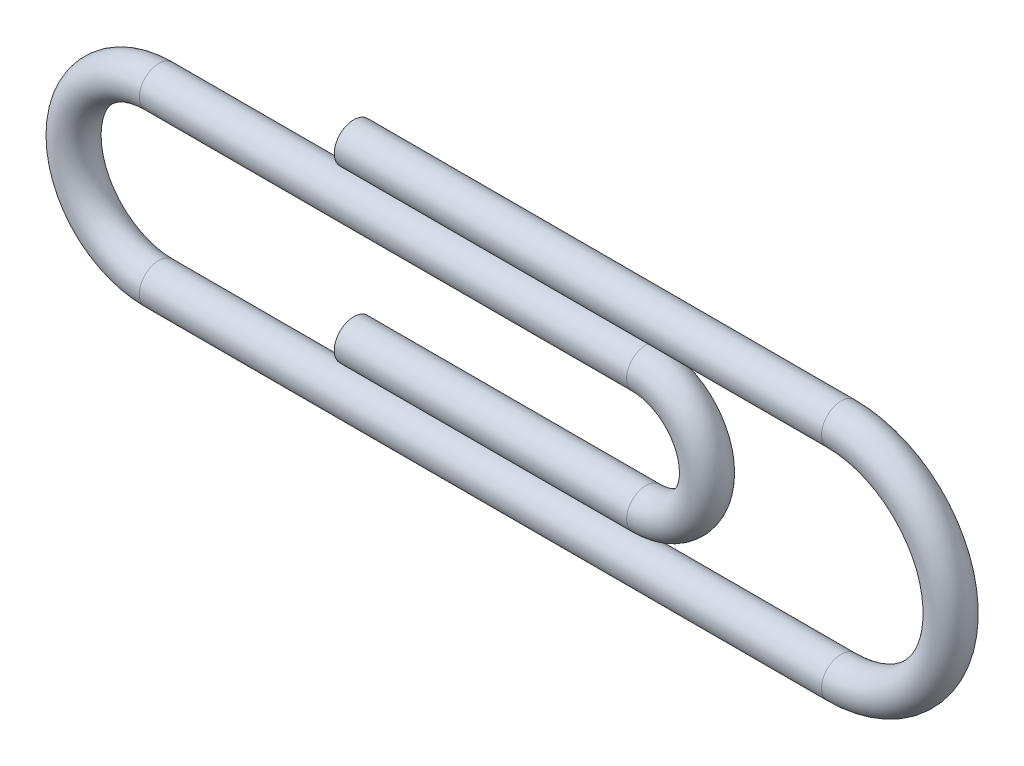
ISO-10303-21;
HEADER;
FILE_DESCRIPTION(('STEP AP214'),'2;1');
FILE_NAME('part.step','',(''),(''),'','','');
FILE_SCHEMA(('AUTOMOTIVE_DESIGN { 1 0 10303 214 1 1 1 1 }'));
ENDSEC;
DATA;
#1=APPLICATION_CONTEXT('core data for automotive mechanical design processes');
#2=APPLICATION_PROTOCOL_DEFINITION('international standard','automotive_design',2000,#1);
#3=PRODUCT_CONTEXT('',#1,'mechanical');
#4=PRODUCT('Part','Part','',(#3));
#5=PRODUCT_RELATED_PRODUCT_CATEGORY('part','',(#4));
#6=PRODUCT_DEFINITION_FORMATION('','',#4);
#7=PRODUCT_DEFINITION_CONTEXT('part definition',#1,'design');
#8=PRODUCT_DEFINITION('design','',#6,#7);
#9=PRODUCT_DEFINITION_SHAPE('','',#8);
#10=(LENGTH_UNIT() NAMED_UNIT(*) SI_UNIT(.MILLI.,.METRE.));
#11=(NAMED_UNIT(*) PLANE_ANGLE_UNIT() SI_UNIT($,.RADIAN.));
#12=(NAMED_UNIT(*) SI_UNIT($,.STERADIAN.) SOLID_ANGLE_UNIT());
#13=UNCERTAINTY_MEASURE_WITH_UNIT(LENGTH_MEASURE(1.E-05),#10,'distance_accuracy_value','');
#14=(GEOMETRIC_REPRESENTATION_CONTEXT(3) GLOBAL_UNCERTAINTY_ASSIGNED_CONTEXT((#13)) GLOBAL_UNIT_ASSIGNED_CONTEXT((#10,
#11,#12)) REPRESENTATION_CONTEXT('',''));
#15=CARTESIAN_POINT('',(0.,0.,0.));
#16=DIRECTION('',(0.,0.,1.));
#17=DIRECTION('',(1.,0.,0.));
#18=AXIS2_PLACEMENT_3D('',#15,#16,#17);
#19=CARTESIAN_POINT('',(60.0000000000001,-12.5,0.));
#20=DIRECTION('',(-1.,0.,0.));
#21=DIRECTION('',(0.,0.,1.));
#22=AXIS2_PLACEMENT_3D('',#19,#20,#21);
#23=CYLINDRICAL_SURFACE('',#22,4.);
#24=CARTESIAN_POINT('',(60.0000000000001,-12.5,0.));
#25=DIRECTION('',(1.,0.,0.));
#26=DIRECTION('',(0.,1.,0.));
#27=AXIS2_PLACEMENT_3D('',#24,#25,#26);
#28=CIRCLE('',#27,4.);
#29=CARTESIAN_POINT('',(60.0000000000002,-16.5,0.));
#30=VERTEX_POINT('',#29);
#31=EDGE_CURVE('E411',#30,#30,#28,.T.);
#32=ORIENTED_EDGE('',*,*,#31,.F.);
#33=EDGE_LOOP('',(#32));
#34=FACE_BOUND('',#33,.T.);
#35=CARTESIAN_POINT('',(0.,-12.5,0.));
#36=DIRECTION('',(1.,0.,0.));
#37=DIRECTION('',(0.,1.,0.));
#38=AXIS2_PLACEMENT_3D('',#35,#36,#37);
#39=CIRCLE('',#38,4.);
#40=CARTESIAN_POINT('',(0.,-8.5,0.));
#41=VERTEX_POINT('',#40);
#42=EDGE_CURVE('E13',#41,#41,#39,.T.);
#43=ORIENTED_EDGE('',*,*,#42,.T.);
#44=EDGE_LOOP('',(#43));
#45=FACE_BOUND('',#44,.T.);
#46=ADVANCED_FACE('F44',(#34,#45),#23,.T.);
#47=CARTESIAN_POINT('',(60.0000000000001,-15.3867513459481,0.));
#48=DIRECTION('',(0.,0.866025403784439,0.5));
#49=DIRECTION('',(0.,-0.5,0.866025403784439));
#50=AXIS2_PLACEMENT_3D('',#47,#48,#49);
#51=PLANE('',#50);
#52=DIRECTION('',(0.,0.5,-0.866025403784438));
#53=VECTOR('',#52,1.);
#54=CARTESIAN_POINT('',(60.0000000000001,-15.3867513459481,0.));
#55=LINE('',#54,#53);
#56=CARTESIAN_POINT('',(60.0000000000001,-15.3867513459481,0.));
#57=VERTEX_POINT('',#56);
#58=CARTESIAN_POINT('',(60.0000000000001,-13.9433756729741,-2.5));
#59=VERTEX_POINT('',#58);
#60=EDGE_CURVE('E407',#57,#59,#55,.T.);
#61=ORIENTED_EDGE('',*,*,#60,.T.);
#62=DIRECTION('',(-1.,0.,0.));
#63=VECTOR('',#62,1.);
#64=CARTESIAN_POINT('',(60.0000000000001,-13.9433756729741,-2.5));
#65=LINE('',#64,#63);
#66=CARTESIAN_POINT('',(0.,-13.9433756729741,-2.5));
#67=VERTEX_POINT('',#66);
#68=EDGE_CURVE('E454',#59,#67,#65,.T.);
#69=ORIENTED_EDGE('',*,*,#68,.T.);
#70=DIRECTION('',(0.,0.5,-0.866025403784438));
#71=VECTOR('',#70,1.);
#72=CARTESIAN_POINT('',(0.,-15.3867513459481,0.));
#73=LINE('',#72,#71);
#74=CARTESIAN_POINT('',(0.,-15.3867513459481,0.));
#75=VERTEX_POINT('',#74);
#76=EDGE_CURVE('E59',#75,#67,#73,.T.);
#77=ORIENTED_EDGE('',*,*,#76,.F.);
#78=DIRECTION('',(-1.,0.,0.));
#79=VECTOR('',#78,1.);
#80=CARTESIAN_POINT('',(60.0000000000001,-15.3867513459481,0.));
#81=LINE('',#80,#79);
#82=EDGE_CURVE('E47',#57,#75,#81,.T.);
#83=ORIENTED_EDGE('',*,*,#82,.F.);
#84=EDGE_LOOP('',(#61,#69,#77,#83));
#85=FACE_BOUND('',#84,.T.);
#86=ADVANCED_FACE('F460',(#85),#51,.T.);
#87=CARTESIAN_POINT('',(60.0000000000001,-11.0566243270259,-2.5));
#88=DIRECTION('',(0.,-0.866025403784439,0.499999999999999));
#89=DIRECTION('',(0.,-0.499999999999999,-0.866025403784439));
#90=AXIS2_PLACEMENT_3D('',#87,#88,#89);
#91=PLANE('',#90);
#92=DIRECTION('',(0.,0.499999999999999,0.866025403784439));
#93=VECTOR('',#92,1.);
#94=CARTESIAN_POINT('',(60.0000000000001,-11.0566243270259,-2.5));
#95=LINE('',#94,#93);
#96=CARTESIAN_POINT('',(60.0000000000001,-11.0566243270259,-2.5));
#97=VERTEX_POINT('',#96);
#98=CARTESIAN_POINT('',(60.0000000000001,-9.61324865405187,0.));
#99=VERTEX_POINT('',#98);
#100=EDGE_CURVE('E404',#97,#99,#95,.T.);
#101=ORIENTED_EDGE('',*,*,#100,.T.);
#102=DIRECTION('',(-1.,0.,0.));
#103=VECTOR('',#102,1.);
#104=CARTESIAN_POINT('',(60.0000000000001,-9.61324865405187,0.));
#105=LINE('',#104,#103);
#106=CARTESIAN_POINT('',(0.,-9.61324865405187,0.));
#107=VERTEX_POINT('',#106);
#108=EDGE_CURVE('E450',#99,#107,#105,.T.);
#109=ORIENTED_EDGE('',*,*,#108,.T.);
#110=DIRECTION('',(0.,0.499999999999999,0.866025403784439));
#111=VECTOR('',#110,1.);
#112=CARTESIAN_POINT('',(0.,-11.0566243270259,-2.5));
#113=LINE('',#112,#111);
#114=CARTESIAN_POINT('',(0.,-11.0566243270259,-2.5));
#115=VERTEX_POINT('',#114);
#116=EDGE_CURVE('E439',#115,#107,#113,.T.);
#117=ORIENTED_EDGE('',*,*,#116,.F.);
#118=DIRECTION('',(-1.,0.,0.));
#119=VECTOR('',#118,1.);
#120=CARTESIAN_POINT('',(60.0000000000001,-11.0566243270259,-2.5));
#121=LINE('',#120,#119);
#122=EDGE_CURVE('E453',#97,#115,#121,.T.);
#123=ORIENTED_EDGE('',*,*,#122,.F.);
#124=EDGE_LOOP('',(#101,#109,#117,#123));
#125=FACE_BOUND('',#124,.T.);
#126=ADVANCED_FACE('F518',(#125),#91,.T.);
#127=CARTESIAN_POINT('',(60.0000000000001,-9.61324865405187,0.));
#128=DIRECTION('',(0.,-0.866025403784439,-0.499999999999999));
#129=DIRECTION('',(0.,0.499999999999999,-0.866025403784439));
#130=AXIS2_PLACEMENT_3D('',#127,#128,#129);
#131=PLANE('',#130);
#132=DIRECTION('',(0.,-0.499999999999999,0.866025403784439));
#133=VECTOR('',#132,1.);
#134=CARTESIAN_POINT('',(60.0000000000001,-9.61324865405187,0.));
#135=LINE('',#134,#133);
#136=CARTESIAN_POINT('',(60.0000000000001,-11.0566243270259,2.5));
#137=VERTEX_POINT('',#136);
#138=EDGE_CURVE('E401',#99,#137,#135,.T.);
#139=ORIENTED_EDGE('',*,*,#138,.T.);
#140=DIRECTION('',(-1.,0.,0.));
#141=VECTOR('',#140,1.);
#142=CARTESIAN_POINT('',(60.0000000000001,-11.0566243270259,2.5));
#143=LINE('',#142,#141);
#144=CARTESIAN_POINT('',(0.,-11.0566243270259,2.5));
#145=VERTEX_POINT('',#144);
#146=EDGE_CURVE('E447',#137,#145,#143,.T.);
#147=ORIENTED_EDGE('',*,*,#146,.T.);
#148=DIRECTION('',(0.,-0.499999999999999,0.866025403784439));
#149=VECTOR('',#148,1.);
#150=CARTESIAN_POINT('',(0.,-9.61324865405187,0.));
#151=LINE('',#150,#149);
#152=EDGE_CURVE('E436',#107,#145,#151,.T.);
#153=ORIENTED_EDGE('',*,*,#152,.F.);
#154=ORIENTED_EDGE('',*,*,#108,.F.);
#155=EDGE_LOOP('',(#139,#147,#153,#154));
#156=FACE_BOUND('',#155,.T.);
#157=ADVANCED_FACE('F522',(#156),#131,.T.);
#158=CARTESIAN_POINT('',(60.0000000000001,-13.9433756729741,2.5));
#159=DIRECTION('',(0.,0.866025403784438,-0.500000000000001));
#160=DIRECTION('',(0.,0.500000000000001,0.866025403784438));
#161=AXIS2_PLACEMENT_3D('',#158,#159,#160);
#162=PLANE('',#161);
#163=DIRECTION('',(0.,-0.5,-0.866025403784438));
#164=VECTOR('',#163,1.);
#165=CARTESIAN_POINT('',(60.0000000000001,-13.9433756729741,2.5));
#166=LINE('',#165,#164);
#167=CARTESIAN_POINT('',(60.0000000000001,-13.9433756729741,2.5));
#168=VERTEX_POINT('',#167);
#169=EDGE_CURVE('E381',#168,#57,#166,.T.);
#170=ORIENTED_EDGE('',*,*,#169,.T.);
#171=ORIENTED_EDGE('',*,*,#82,.T.);
#172=DIRECTION('',(0.,-0.5,-0.866025403784438));
#173=VECTOR('',#172,1.);
#174=CARTESIAN_POINT('',(0.,-13.9433756729741,2.5));
#175=LINE('',#174,#173);
#176=CARTESIAN_POINT('',(0.,-13.9433756729741,2.5));
#177=VERTEX_POINT('',#176);
#178=EDGE_CURVE('E414',#177,#75,#175,.T.);
#179=ORIENTED_EDGE('',*,*,#178,.F.);
#180=DIRECTION('',(-1.,0.,0.));
#181=VECTOR('',#180,1.);
#182=CARTESIAN_POINT('',(60.0000000000001,-13.9433756729741,2.5));
#183=LINE('',#182,#181);
#184=EDGE_CURVE('E443',#168,#177,#183,.T.);
#185=ORIENTED_EDGE('',*,*,#184,.F.);
#186=EDGE_LOOP('',(#170,#171,#179,#185));
#187=FACE_BOUND('',#186,.T.);
#188=ADVANCED_FACE('F457',(#187),#162,.T.);
#189=CARTESIAN_POINT('',(60.0000000000001,0.,0.));
#190=DIRECTION('',(0.,0.,-1.));
#191=DIRECTION('',(-1.,0.,0.));
#192=AXIS2_PLACEMENT_3D('',#189,#190,#191);
#193=TOROIDAL_SURFACE('',#192,12.5,4.);
#194=CARTESIAN_POINT('',(60.,12.5,0.));
#195=DIRECTION('',(-1.,0.,0.));
#196=DIRECTION('',(0.,-1.,0.));
#197=AXIS2_PLACEMENT_3D('',#194,#195,#196);
#198=CIRCLE('',#197,4.);
#199=CARTESIAN_POINT('',(60.,16.5,0.));
#200=VERTEX_POINT('',#199);
#201=EDGE_CURVE('E378',#200,#200,#198,.T.);
#202=CARTESIAN_POINT('',(60.0000000000001,0.,0.));
#203=DIRECTION('',(0.,0.,-1.));
#204=DIRECTION('',(-1.,0.,0.));
#205=AXIS2_PLACEMENT_3D('',#202,#203,#204);
#206=CIRCLE('',#205,16.5);
#207=EDGE_CURVE('',#200,#30,#206,.T.);
#208=ORIENTED_EDGE('',*,*,#201,.F.);
#209=ORIENTED_EDGE('',*,*,#31,.T.);
#210=ORIENTED_EDGE('',*,*,#207,.T.);
#211=ORIENTED_EDGE('',*,*,#207,.F.);
#212=EDGE_LOOP('',(#208,#210,#209,#211));
#213=FACE_BOUND('',#212,.T.);
#214=ADVANCED_FACE('F840',(#213),#193,.T.);
#215=CARTESIAN_POINT('',(60.0000000000001,0.,0.));
#216=DIRECTION('',(0.,0.,1.));
#217=DIRECTION('',(1.,0.,0.));
#218=AXIS2_PLACEMENT_3D('',#215,#216,#217);
#219=CONICAL_SURFACE('',#218,15.3867513459481,0.523598775598299);
#220=DIRECTION('',(0.,-0.5,-0.866025403784438));
#221=VECTOR('',#220,1.);
#222=CARTESIAN_POINT('',(60.,15.3867513459481,0.));
#223=LINE('',#222,#221);
#224=CARTESIAN_POINT('',(60.,15.3867513459481,0.));
#225=VERTEX_POINT('',#224);
#226=CARTESIAN_POINT('',(60.,13.9433756729741,-2.5));
#227=VERTEX_POINT('',#226);
#228=EDGE_CURVE('E374',#225,#227,#223,.T.);
#229=ORIENTED_EDGE('',*,*,#228,.T.);
#230=CARTESIAN_POINT('',(60.0000000000001,0.,-2.5));
#231=DIRECTION('',(0.,0.,-1.));
#232=DIRECTION('',(-1.,0.,0.));
#233=AXIS2_PLACEMENT_3D('',#230,#231,#232);
#234=CIRCLE('',#233,13.9433756729741);
#235=EDGE_CURVE('E427',#227,#59,#234,.T.);
#236=ORIENTED_EDGE('',*,*,#235,.T.);
#237=ORIENTED_EDGE('',*,*,#60,.F.);
#238=CARTESIAN_POINT('',(60.0000000000001,0.,0.));
#239=DIRECTION('',(0.,0.,-1.));
#240=DIRECTION('',(-1.,0.,0.));
#241=AXIS2_PLACEMENT_3D('',#238,#239,#240);
#242=CIRCLE('',#241,15.3867513459481);
#243=EDGE_CURVE('E415',#225,#57,#242,.T.);
#244=ORIENTED_EDGE('',*,*,#243,.F.);
#245=EDGE_LOOP('',(#229,#236,#237,#244));
#246=FACE_BOUND('',#245,.T.);
#247=ADVANCED_FACE('F462',(#246),#219,.F.);
#248=CARTESIAN_POINT('',(60.0000000000001,0.,-2.5));
#249=DIRECTION('',(0.,0.,-1.));
#250=DIRECTION('',(-1.,0.,0.));
#251=AXIS2_PLACEMENT_3D('',#248,#249,#250);
#252=CONICAL_SURFACE('',#251,11.0566243270259,0.523598775598298);
#253=DIRECTION('',(0.,-0.499999999999999,0.866025403784439));
#254=VECTOR('',#253,1.);
#255=CARTESIAN_POINT('',(60.,11.0566243270259,-2.5));
#256=LINE('',#255,#254);
#257=CARTESIAN_POINT('',(60.,11.0566243270259,-2.5));
#258=VERTEX_POINT('',#257);
#259=CARTESIAN_POINT('',(60.,9.61324865405187,0.));
#260=VERTEX_POINT('',#259);
#261=EDGE_CURVE('E371',#258,#260,#256,.T.);
#262=ORIENTED_EDGE('',*,*,#261,.T.);
#263=CARTESIAN_POINT('',(60.0000000000001,0.,0.));
#264=DIRECTION('',(0.,0.,-1.));
#265=DIRECTION('',(-1.,0.,0.));
#266=AXIS2_PLACEMENT_3D('',#263,#264,#265);
#267=CIRCLE('',#266,9.61324865405187);
#268=EDGE_CURVE('E421',#260,#99,#267,.T.);
#269=ORIENTED_EDGE('',*,*,#268,.T.);
#270=ORIENTED_EDGE('',*,*,#100,.F.);
#271=CARTESIAN_POINT('',(60.0000000000001,0.,-2.5));
#272=DIRECTION('',(0.,0.,-1.));
#273=DIRECTION('',(-1.,0.,0.));
#274=AXIS2_PLACEMENT_3D('',#271,#272,#273);
#275=CIRCLE('',#274,11.0566243270259);
#276=EDGE_CURVE('E424',#258,#97,#275,.T.);
#277=ORIENTED_EDGE('',*,*,#276,.F.);
#278=EDGE_LOOP('',(#262,#269,#270,#277));
#279=FACE_BOUND('',#278,.T.);
#280=ADVANCED_FACE('F515',(#279),#252,.T.);
#281=CARTESIAN_POINT('',(60.0000000000001,0.,0.));
#282=DIRECTION('',(0.,0.,1.));
#283=DIRECTION('',(1.,0.,0.));
#284=AXIS2_PLACEMENT_3D('',#281,#282,#283);
#285=CONICAL_SURFACE('',#284,9.61324865405187,0.523598775598298);
#286=DIRECTION('',(0.,0.499999999999999,0.866025403784439));
#287=VECTOR('',#286,1.);
#288=CARTESIAN_POINT('',(60.,9.61324865405187,0.));
#289=LINE('',#288,#287);
#290=CARTESIAN_POINT('',(60.,11.0566243270259,2.5));
#291=VERTEX_POINT('',#290);
#292=EDGE_CURVE('E368',#260,#291,#289,.T.);
#293=ORIENTED_EDGE('',*,*,#292,.T.);
#294=CARTESIAN_POINT('',(60.0000000000001,0.,2.5));
#295=DIRECTION('',(0.,0.,-1.));
#296=DIRECTION('',(-1.,0.,0.));
#297=AXIS2_PLACEMENT_3D('',#294,#295,#296);
#298=CIRCLE('',#297,11.0566243270259);
#299=EDGE_CURVE('E418',#291,#137,#298,.T.);
#300=ORIENTED_EDGE('',*,*,#299,.T.);
#301=ORIENTED_EDGE('',*,*,#138,.F.);
#302=ORIENTED_EDGE('',*,*,#268,.F.);
#303=EDGE_LOOP('',(#293,#300,#301,#302));
#304=FACE_BOUND('',#303,.T.);
#305=ADVANCED_FACE('F520',(#304),#285,.T.);
#306=CARTESIAN_POINT('',(60.0000000000001,0.,2.5));
#307=DIRECTION('',(0.,0.,-1.));
#308=DIRECTION('',(-1.,0.,0.));
#309=AXIS2_PLACEMENT_3D('',#306,#307,#308);
#310=CONICAL_SURFACE('',#309,13.9433756729741,0.523598775598299);
#311=DIRECTION('',(0.,0.5,-0.866025403784438));
#312=VECTOR('',#311,1.);
#313=CARTESIAN_POINT('',(60.,13.9433756729741,2.5));
#314=LINE('',#313,#312);
#315=CARTESIAN_POINT('',(60.,13.9433756729741,2.5));
#316=VERTEX_POINT('',#315);
#317=EDGE_CURVE('E348',#316,#225,#314,.T.);
#318=ORIENTED_EDGE('',*,*,#317,.T.);
#319=ORIENTED_EDGE('',*,*,#243,.T.);
#320=ORIENTED_EDGE('',*,*,#169,.F.);
#321=CARTESIAN_POINT('',(60.0000000000001,0.,2.5));
#322=DIRECTION('',(0.,0.,-1.));
#323=DIRECTION('',(-1.,0.,0.));
#324=AXIS2_PLACEMENT_3D('',#321,#322,#323);
#325=CIRCLE('',#324,13.9433756729741);
#326=EDGE_CURVE('E410',#316,#168,#325,.T.);
#327=ORIENTED_EDGE('',*,*,#326,.F.);
#328=EDGE_LOOP('',(#318,#319,#320,#327));
#329=FACE_BOUND('',#328,.T.);
#330=ADVANCED_FACE('F527',(#329),#310,.F.);
#331=CARTESIAN_POINT('',(-40.,12.5,0.));
#332=DIRECTION('',(1.,0.,0.));
#333=DIRECTION('',(0.,0.,-1.));
#334=AXIS2_PLACEMENT_3D('',#331,#332,#333);
#335=CYLINDRICAL_SURFACE('',#334,4.);
#336=CARTESIAN_POINT('',(-40.,12.5,0.));
#337=DIRECTION('',(-1.,0.,0.));
#338=DIRECTION('',(0.,-1.,0.));
#339=AXIS2_PLACEMENT_3D('',#336,#337,#338);
#340=CIRCLE('',#339,4.);
#341=CARTESIAN_POINT('',(-40.,16.5,0.));
#342=VERTEX_POINT('',#341);
#343=EDGE_CURVE('E345',#342,#342,#340,.T.);
#344=ORIENTED_EDGE('',*,*,#343,.F.);
#345=EDGE_LOOP('',(#344));
#346=FACE_BOUND('',#345,.T.);
#347=ORIENTED_EDGE('',*,*,#201,.T.);
#348=EDGE_LOOP('',(#347));
#349=FACE_BOUND('',#348,.T.);
#350=ADVANCED_FACE('F803',(#346,#349),#335,.T.);
#351=CARTESIAN_POINT('',(-40.,15.3867513459481,0.));
#352=DIRECTION('',(0.,-0.866025403784438,0.5));
#353=DIRECTION('',(0.,-0.5,-0.866025403784439));
#354=AXIS2_PLACEMENT_3D('',#351,#352,#353);
#355=PLANE('',#354);
#356=DIRECTION('',(0.,-0.5,-0.866025403784438));
#357=VECTOR('',#356,1.);
#358=CARTESIAN_POINT('',(-40.,15.3867513459481,0.));
#359=LINE('',#358,#357);
#360=CARTESIAN_POINT('',(-40.,15.3867513459481,0.));
#361=VERTEX_POINT('',#360);
#362=CARTESIAN_POINT('',(-40.,13.9433756729741,-2.5));
#363=VERTEX_POINT('',#362);
#364=EDGE_CURVE('E341',#361,#363,#359,.T.);
#365=ORIENTED_EDGE('',*,*,#364,.T.);
#366=DIRECTION('',(1.,0.,0.));
#367=VECTOR('',#366,1.);
#368=CARTESIAN_POINT('',(-40.,13.9433756729741,-2.5));
#369=LINE('',#368,#367);
#370=EDGE_CURVE('E394',#363,#227,#369,.T.);
#371=ORIENTED_EDGE('',*,*,#370,.T.);
#372=ORIENTED_EDGE('',*,*,#228,.F.);
#373=DIRECTION('',(1.,0.,0.));
#374=VECTOR('',#373,1.);
#375=CARTESIAN_POINT('',(-40.,15.3867513459481,0.));
#376=LINE('',#375,#374);
#377=EDGE_CURVE('E382',#361,#225,#376,.T.);
#378=ORIENTED_EDGE('',*,*,#377,.F.);
#379=EDGE_LOOP('',(#365,#371,#372,#378));
#380=FACE_BOUND('',#379,.T.);
#381=ADVANCED_FACE('F467',(#380),#355,.T.);
#382=CARTESIAN_POINT('',(-40.,11.0566243270259,-2.5));
#383=DIRECTION('',(0.,0.866025403784439,0.499999999999999));
#384=DIRECTION('',(0.,-0.499999999999999,0.866025403784439));
#385=AXIS2_PLACEMENT_3D('',#382,#383,#384);
#386=PLANE('',#385);
#387=DIRECTION('',(0.,-0.499999999999999,0.866025403784439));
#388=VECTOR('',#387,1.);
#389=CARTESIAN_POINT('',(-40.,11.0566243270259,-2.5));
#390=LINE('',#389,#388);
#391=CARTESIAN_POINT('',(-40.,11.0566243270259,-2.5));
#392=VERTEX_POINT('',#391);
#393=CARTESIAN_POINT('',(-40.,9.61324865405187,0.));
#394=VERTEX_POINT('',#393);
#395=EDGE_CURVE('E338',#392,#394,#390,.T.);
#396=ORIENTED_EDGE('',*,*,#395,.T.);
#397=DIRECTION('',(1.,0.,0.));
#398=VECTOR('',#397,1.);
#399=CARTESIAN_POINT('',(-40.,9.61324865405187,0.));
#400=LINE('',#399,#398);
#401=EDGE_CURVE('E388',#394,#260,#400,.T.);
#402=ORIENTED_EDGE('',*,*,#401,.T.);
#403=ORIENTED_EDGE('',*,*,#261,.F.);
#404=DIRECTION('',(1.,0.,0.));
#405=VECTOR('',#404,1.);
#406=CARTESIAN_POINT('',(-40.,11.0566243270259,-2.5));
#407=LINE('',#406,#405);
#408=EDGE_CURVE('E391',#392,#258,#407,.T.);
#409=ORIENTED_EDGE('',*,*,#408,.F.);
#410=EDGE_LOOP('',(#396,#402,#403,#409));
#411=FACE_BOUND('',#410,.T.);
#412=ADVANCED_FACE('F512',(#411),#386,.T.);
#413=CARTESIAN_POINT('',(-40.,9.61324865405187,0.));
#414=DIRECTION('',(0.,0.866025403784439,-0.499999999999999));
#415=DIRECTION('',(0.,0.499999999999999,0.866025403784439));
#416=AXIS2_PLACEMENT_3D('',#413,#414,#415);
#417=PLANE('',#416);
#418=DIRECTION('',(0.,0.499999999999999,0.866025403784439));
#419=VECTOR('',#418,1.);
#420=CARTESIAN_POINT('',(-40.,9.61324865405187,0.));
#421=LINE('',#420,#419);
#422=CARTESIAN_POINT('',(-40.,11.0566243270259,2.5));
#423=VERTEX_POINT('',#422);
#424=EDGE_CURVE('E335',#394,#423,#421,.T.);
#425=ORIENTED_EDGE('',*,*,#424,.T.);
#426=DIRECTION('',(1.,0.,0.));
#427=VECTOR('',#426,1.);
#428=CARTESIAN_POINT('',(-40.,11.0566243270259,2.5));
#429=LINE('',#428,#427);
#430=EDGE_CURVE('E385',#423,#291,#429,.T.);
#431=ORIENTED_EDGE('',*,*,#430,.T.);
#432=ORIENTED_EDGE('',*,*,#292,.F.);
#433=ORIENTED_EDGE('',*,*,#401,.F.);
#434=EDGE_LOOP('',(#425,#431,#432,#433));
#435=FACE_BOUND('',#434,.T.);
#436=ADVANCED_FACE('F508',(#435),#417,.T.);
#437=CARTESIAN_POINT('',(-40.,13.9433756729741,2.5));
#438=DIRECTION('',(0.,-0.866025403784438,-0.5));
#439=DIRECTION('',(0.,0.5,-0.866025403784438));
#440=AXIS2_PLACEMENT_3D('',#437,#438,#439);
#441=PLANE('',#440);
#442=DIRECTION('',(0.,0.5,-0.866025403784438));
#443=VECTOR('',#442,1.);
#444=CARTESIAN_POINT('',(-40.,13.9433756729741,2.5));
#445=LINE('',#444,#443);
#446=CARTESIAN_POINT('',(-40.,13.9433756729741,2.5));
#447=VERTEX_POINT('',#446);
#448=EDGE_CURVE('E316',#447,#361,#445,.T.);
#449=ORIENTED_EDGE('',*,*,#448,.T.);
#450=ORIENTED_EDGE('',*,*,#377,.T.);
#451=ORIENTED_EDGE('',*,*,#317,.F.);
#452=DIRECTION('',(1.,0.,0.));
#453=VECTOR('',#452,1.);
#454=CARTESIAN_POINT('',(-40.,13.9433756729741,2.5));
#455=LINE('',#454,#453);
#456=EDGE_CURVE('E377',#447,#316,#455,.T.);
#457=ORIENTED_EDGE('',*,*,#456,.F.);
#458=EDGE_LOOP('',(#449,#450,#451,#457));
#459=FACE_BOUND('',#458,.T.);
#460=ADVANCED_FACE('F530',(#459),#441,.T.);
#461=CARTESIAN_POINT('',(-40.,-5.,0.));
#462=DIRECTION('',(0.,0.,-1.));
#463=DIRECTION('',(-1.,0.,0.));
#464=AXIS2_PLACEMENT_3D('',#461,#462,#463);
#465=TOROIDAL_SURFACE('',#464,17.5,4.);
#466=CARTESIAN_POINT('',(-40.,-22.5,0.));
#467=DIRECTION('',(1.,0.,0.));
#468=DIRECTION('',(0.,1.,0.));
#469=AXIS2_PLACEMENT_3D('',#466,#467,#468);
#470=CIRCLE('',#469,4.);
#471=CARTESIAN_POINT('',(-40.,-26.5,0.));
#472=VERTEX_POINT('',#471);
#473=EDGE_CURVE('E313',#472,#472,#470,.T.);
#474=CARTESIAN_POINT('',(-40.,-5.,0.));
#475=DIRECTION('',(0.,0.,-1.));
#476=DIRECTION('',(-1.,0.,0.));
#477=AXIS2_PLACEMENT_3D('',#474,#475,#476);
#478=CIRCLE('',#477,21.5);
#479=EDGE_CURVE('',#472,#342,#478,.T.);
#480=ORIENTED_EDGE('',*,*,#473,.F.);
#481=ORIENTED_EDGE('',*,*,#343,.T.);
#482=ORIENTED_EDGE('',*,*,#479,.T.);
#483=ORIENTED_EDGE('',*,*,#479,.F.);
#484=EDGE_LOOP('',(#480,#482,#481,#483));
#485=FACE_BOUND('',#484,.T.);
#486=ADVANCED_FACE('F766',(#485),#465,.T.);
#487=CARTESIAN_POINT('',(-40.,-5.,0.));
#488=DIRECTION('',(0.,0.,1.));
#489=DIRECTION('',(1.,0.,0.));
#490=AXIS2_PLACEMENT_3D('',#487,#488,#489);
#491=CONICAL_SURFACE('',#490,20.3867513459481,0.523598775598299);
#492=DIRECTION('',(0.,0.5,-0.866025403784438));
#493=VECTOR('',#492,1.);
#494=CARTESIAN_POINT('',(-40.,-25.3867513459481,0.));
#495=LINE('',#494,#493);
#496=CARTESIAN_POINT('',(-40.,-25.3867513459481,0.));
#497=VERTEX_POINT('',#496);
#498=CARTESIAN_POINT('',(-40.,-23.9433756729741,-2.5));
#499=VERTEX_POINT('',#498);
#500=EDGE_CURVE('E309',#497,#499,#495,.T.);
#501=ORIENTED_EDGE('',*,*,#500,.T.);
#502=CARTESIAN_POINT('',(-40.,-5.,-2.5));
#503=DIRECTION('',(0.,0.,-1.));
#504=DIRECTION('',(-1.,0.,0.));
#505=AXIS2_PLACEMENT_3D('',#502,#503,#504);
#506=CIRCLE('',#505,18.9433756729741);
#507=EDGE_CURVE('E361',#499,#363,#506,.T.);
#508=ORIENTED_EDGE('',*,*,#507,.T.);
#509=ORIENTED_EDGE('',*,*,#364,.F.);
#510=CARTESIAN_POINT('',(-40.,-5.,0.));
#511=DIRECTION('',(0.,0.,-1.));
#512=DIRECTION('',(-1.,0.,0.));
#513=AXIS2_PLACEMENT_3D('',#510,#511,#512);
#514=CIRCLE('',#513,20.3867513459481);
#515=EDGE_CURVE('E349',#497,#361,#514,.T.);
#516=ORIENTED_EDGE('',*,*,#515,.F.);
#517=EDGE_LOOP('',(#501,#508,#509,#516));
#518=FACE_BOUND('',#517,.T.);
#519=ADVANCED_FACE('F469',(#518),#491,.F.);
#520=CARTESIAN_POINT('',(-40.,-5.,-2.5));
#521=DIRECTION('',(0.,0.,-1.));
#522=DIRECTION('',(-1.,0.,0.));
#523=AXIS2_PLACEMENT_3D('',#520,#521,#522);
#524=CONICAL_SURFACE('',#523,16.0566243270259,0.523598775598298);
#525=DIRECTION('',(0.,0.499999999999999,0.866025403784439));
#526=VECTOR('',#525,1.);
#527=CARTESIAN_POINT('',(-40.,-21.0566243270259,-2.5));
#528=LINE('',#527,#526);
#529=CARTESIAN_POINT('',(-40.,-21.0566243270259,-2.5));
#530=VERTEX_POINT('',#529);
#531=CARTESIAN_POINT('',(-40.,-19.6132486540519,0.));
#532=VERTEX_POINT('',#531);
#533=EDGE_CURVE('E306',#530,#532,#528,.T.);
#534=ORIENTED_EDGE('',*,*,#533,.T.);
#535=CARTESIAN_POINT('',(-40.,-5.,0.));
#536=DIRECTION('',(0.,0.,-1.));
#537=DIRECTION('',(-1.,0.,0.));
#538=AXIS2_PLACEMENT_3D('',#535,#536,#537);
#539=CIRCLE('',#538,14.6132486540519);
#540=EDGE_CURVE('E355',#532,#394,#539,.T.);
#541=ORIENTED_EDGE('',*,*,#540,.T.);
#542=ORIENTED_EDGE('',*,*,#395,.F.);
#543=CARTESIAN_POINT('',(-40.,-5.,-2.5));
#544=DIRECTION('',(0.,0.,-1.));
#545=DIRECTION('',(-1.,0.,0.));
#546=AXIS2_PLACEMENT_3D('',#543,#544,#545);
#547=CIRCLE('',#546,16.0566243270259);
#548=EDGE_CURVE('E358',#530,#392,#547,.T.);
#549=ORIENTED_EDGE('',*,*,#548,.F.);
#550=EDGE_LOOP('',(#534,#541,#542,#549));
#551=FACE_BOUND('',#550,.T.);
#552=ADVANCED_FACE('F500',(#551),#524,.T.);
#553=CARTESIAN_POINT('',(-40.,-5.,0.));
#554=DIRECTION('',(0.,0.,1.));
#555=DIRECTION('',(1.,0.,0.));
#556=AXIS2_PLACEMENT_3D('',#553,#554,#555);
#557=CONICAL_SURFACE('',#556,14.6132486540519,0.523598775598298);
#558=DIRECTION('',(0.,-0.499999999999999,0.866025403784439));
#559=VECTOR('',#558,1.);
#560=CARTESIAN_POINT('',(-40.,-19.6132486540519,0.));
#561=LINE('',#560,#559);
#562=CARTESIAN_POINT('',(-40.,-21.0566243270259,2.5));
#563=VERTEX_POINT('',#562);
#564=EDGE_CURVE('E303',#532,#563,#561,.T.);
#565=ORIENTED_EDGE('',*,*,#564,.T.);
#566=CARTESIAN_POINT('',(-40.,-5.,2.5));
#567=DIRECTION('',(0.,0.,-1.));
#568=DIRECTION('',(-1.,0.,0.));
#569=AXIS2_PLACEMENT_3D('',#566,#567,#568);
#570=CIRCLE('',#569,16.0566243270259);
#571=EDGE_CURVE('E352',#563,#423,#570,.T.);
#572=ORIENTED_EDGE('',*,*,#571,.T.);
#573=ORIENTED_EDGE('',*,*,#424,.F.);
#574=ORIENTED_EDGE('',*,*,#540,.F.);
#575=EDGE_LOOP('',(#565,#572,#573,#574));
#576=FACE_BOUND('',#575,.T.);
#577=ADVANCED_FACE('F505',(#576),#557,.T.);
#578=CARTESIAN_POINT('',(-40.,-5.,2.5));
#579=DIRECTION('',(0.,0.,-1.));
#580=DIRECTION('',(-1.,0.,0.));
#581=AXIS2_PLACEMENT_3D('',#578,#579,#580);
#582=CONICAL_SURFACE('',#581,18.9433756729741,0.523598775598299);
#583=DIRECTION('',(0.,-0.5,-0.866025403784438));
#584=VECTOR('',#583,1.);
#585=CARTESIAN_POINT('',(-40.,-23.9433756729741,2.5));
#586=LINE('',#585,#584);
#587=CARTESIAN_POINT('',(-40.,-23.9433756729741,2.5));
#588=VERTEX_POINT('',#587);
#589=EDGE_CURVE('E286',#588,#497,#586,.T.);
#590=ORIENTED_EDGE('',*,*,#589,.T.);
#591=ORIENTED_EDGE('',*,*,#515,.T.);
#592=ORIENTED_EDGE('',*,*,#448,.F.);
#593=CARTESIAN_POINT('',(-40.,-5.,2.5));
#594=DIRECTION('',(0.,0.,-1.));
#595=DIRECTION('',(-1.,0.,0.));
#596=AXIS2_PLACEMENT_3D('',#593,#594,#595);
#597=CIRCLE('',#596,18.9433756729741);
#598=EDGE_CURVE('E344',#588,#447,#597,.T.);
#599=ORIENTED_EDGE('',*,*,#598,.F.);
#600=EDGE_LOOP('',(#590,#591,#592,#599));
#601=FACE_BOUND('',#600,.T.);
#602=ADVANCED_FACE('F533',(#601),#582,.F.);
#603=CARTESIAN_POINT('',(100.,-22.5,0.));
#604=DIRECTION('',(-1.,0.,0.));
#605=DIRECTION('',(0.,0.,1.));
#606=AXIS2_PLACEMENT_3D('',#603,#604,#605);
#607=CYLINDRICAL_SURFACE('',#606,4.);
#608=CARTESIAN_POINT('',(100.,-22.5,0.));
#609=DIRECTION('',(1.,0.,0.));
#610=DIRECTION('',(0.,1.,0.));
#611=AXIS2_PLACEMENT_3D('',#608,#609,#610);
#612=CIRCLE('',#611,4.);
#613=CARTESIAN_POINT('',(100.,-26.5,0.));
#614=VERTEX_POINT('',#613);
#615=EDGE_CURVE('E284',#614,#614,#612,.T.);
#616=ORIENTED_EDGE('',*,*,#615,.F.);
#617=EDGE_LOOP('',(#616));
#618=FACE_BOUND('',#617,.T.);
#619=ORIENTED_EDGE('',*,*,#473,.T.);
#620=EDGE_LOOP('',(#619));
#621=FACE_BOUND('',#620,.T.);
#622=ADVANCED_FACE('F729',(#618,#621),#607,.T.);
#623=CARTESIAN_POINT('',(100.,-25.3867513459481,0.));
#624=DIRECTION('',(0.,0.866025403784439,0.5));
#625=DIRECTION('',(0.,-0.5,0.866025403784439));
#626=AXIS2_PLACEMENT_3D('',#623,#624,#625);
#627=PLANE('',#626);
#628=DIRECTION('',(0.,0.5,-0.866025403784438));
#629=VECTOR('',#628,1.);
#630=CARTESIAN_POINT('',(100.,-25.3867513459481,0.));
#631=LINE('',#630,#629);
#632=CARTESIAN_POINT('',(100.,-25.3867513459481,0.));
#633=VERTEX_POINT('',#632);
#634=CARTESIAN_POINT('',(100.,-23.9433756729741,-2.5));
#635=VERTEX_POINT('',#634);
#636=EDGE_CURVE('E219',#633,#635,#631,.T.);
#637=ORIENTED_EDGE('',*,*,#636,.T.);
#638=DIRECTION('',(-1.,0.,0.));
#639=VECTOR('',#638,1.);
#640=CARTESIAN_POINT('',(100.,-23.9433756729741,-2.5));
#641=LINE('',#640,#639);
#642=EDGE_CURVE('E328',#635,#499,#641,.T.);
#643=ORIENTED_EDGE('',*,*,#642,.T.);
#644=ORIENTED_EDGE('',*,*,#500,.F.);
#645=DIRECTION('',(-1.,0.,0.));
#646=VECTOR('',#645,1.);
#647=CARTESIAN_POINT('',(100.,-25.3867513459481,0.));
#648=LINE('',#647,#646);
#649=EDGE_CURVE('E317',#633,#497,#648,.T.);
#650=ORIENTED_EDGE('',*,*,#649,.F.);
#651=EDGE_LOOP('',(#637,#643,#644,#650));
#652=FACE_BOUND('',#651,.T.);
#653=ADVANCED_FACE('F472',(#652),#627,.T.);
#654=CARTESIAN_POINT('',(100.,-21.0566243270259,-2.5));
#655=DIRECTION('',(0.,-0.866025403784439,0.499999999999999));
#656=DIRECTION('',(0.,-0.499999999999999,-0.866025403784439));
#657=AXIS2_PLACEMENT_3D('',#654,#655,#656);
#658=PLANE('',#657);
#659=DIRECTION('',(0.,0.499999999999999,0.866025403784439));
#660=VECTOR('',#659,1.);
#661=CARTESIAN_POINT('',(100.,-21.0566243270259,-2.5));
#662=LINE('',#661,#660);
#663=CARTESIAN_POINT('',(100.,-21.0566243270259,-2.5));
#664=VERTEX_POINT('',#663);
#665=CARTESIAN_POINT('',(100.,-19.6132486540519,0.));
#666=VERTEX_POINT('',#665);
#667=EDGE_CURVE('E279',#664,#666,#662,.T.);
#668=ORIENTED_EDGE('',*,*,#667,.T.);
#669=DIRECTION('',(-1.,0.,0.));
#670=VECTOR('',#669,1.);
#671=CARTESIAN_POINT('',(100.,-19.6132486540519,0.));
#672=LINE('',#671,#670);
#673=EDGE_CURVE('E322',#666,#532,#672,.T.);
#674=ORIENTED_EDGE('',*,*,#673,.T.);
#675=ORIENTED_EDGE('',*,*,#533,.F.);
#676=DIRECTION('',(-1.,0.,0.));
#677=VECTOR('',#676,1.);
#678=CARTESIAN_POINT('',(100.,-21.0566243270259,-2.5));
#679=LINE('',#678,#677);
#680=EDGE_CURVE('E325',#664,#530,#679,.T.);
#681=ORIENTED_EDGE('',*,*,#680,.F.);
#682=EDGE_LOOP('',(#668,#674,#675,#681));
#683=FACE_BOUND('',#682,.T.);
#684=ADVANCED_FACE('F496',(#683),#658,.T.);
#685=CARTESIAN_POINT('',(100.,-19.6132486540519,0.));
#686=DIRECTION('',(0.,-0.866025403784439,-0.499999999999999));
#687=DIRECTION('',(0.,0.499999999999999,-0.866025403784439));
#688=AXIS2_PLACEMENT_3D('',#685,#686,#687);
#689=PLANE('',#688);
#690=DIRECTION('',(0.,-0.499999999999999,0.866025403784439));
#691=VECTOR('',#690,1.);
#692=CARTESIAN_POINT('',(100.,-19.6132486540519,0.));
#693=LINE('',#692,#691);
#694=CARTESIAN_POINT('',(100.,-21.0566243270259,2.5));
#695=VERTEX_POINT('',#694);
#696=EDGE_CURVE('E276',#666,#695,#693,.T.);
#697=ORIENTED_EDGE('',*,*,#696,.T.);
#698=DIRECTION('',(-1.,0.,0.));
#699=VECTOR('',#698,1.);
#700=CARTESIAN_POINT('',(100.,-21.0566243270259,2.5));
#701=LINE('',#700,#699);
#702=EDGE_CURVE('E319',#695,#563,#701,.T.);
#703=ORIENTED_EDGE('',*,*,#702,.T.);
#704=ORIENTED_EDGE('',*,*,#564,.F.);
#705=ORIENTED_EDGE('',*,*,#673,.F.);
#706=EDGE_LOOP('',(#697,#703,#704,#705));
#707=FACE_BOUND('',#706,.T.);
#708=ADVANCED_FACE('F503',(#707),#689,.T.);
#709=CARTESIAN_POINT('',(100.,-23.9433756729741,2.5));
#710=DIRECTION('',(0.,0.866025403784438,-0.5));
#711=DIRECTION('',(0.,0.5,0.866025403784438));
#712=AXIS2_PLACEMENT_3D('',#709,#710,#711);
#713=PLANE('',#712);
#714=DIRECTION('',(0.,-0.5,-0.866025403784438));
#715=VECTOR('',#714,1.);
#716=CARTESIAN_POINT('',(100.,-23.9433756729741,2.5));
#717=LINE('',#716,#715);
#718=CARTESIAN_POINT('',(100.,-23.9433756729741,2.5));
#719=VERTEX_POINT('',#718);
#720=EDGE_CURVE('E215',#719,#633,#717,.T.);
#721=ORIENTED_EDGE('',*,*,#720,.T.);
#722=ORIENTED_EDGE('',*,*,#649,.T.);
#723=ORIENTED_EDGE('',*,*,#589,.F.);
#724=DIRECTION('',(-1.,0.,0.));
#725=VECTOR('',#724,1.);
#726=CARTESIAN_POINT('',(100.,-23.9433756729741,2.5));
#727=LINE('',#726,#725);
#728=EDGE_CURVE('E312',#719,#588,#727,.T.);
#729=ORIENTED_EDGE('',*,*,#728,.F.);
#730=EDGE_LOOP('',(#721,#722,#723,#729));
#731=FACE_BOUND('',#730,.T.);
#732=ADVANCED_FACE('F536',(#731),#713,.T.);
#733=CARTESIAN_POINT('',(100.,0.,0.));
#734=DIRECTION('',(0.,0.,-1.));
#735=DIRECTION('',(-1.,0.,0.));
#736=AXIS2_PLACEMENT_3D('',#733,#734,#735);
#737=TOROIDAL_SURFACE('',#736,22.5,4.);
#738=CARTESIAN_POINT('',(100.,22.5,0.));
#739=DIRECTION('',(-1.,0.,0.));
#740=DIRECTION('',(0.,-1.,0.));
#741=AXIS2_PLACEMENT_3D('',#738,#739,#740);
#742=CIRCLE('',#741,4.);
#743=CARTESIAN_POINT('',(100.,26.5,0.));
#744=VERTEX_POINT('',#743);
#745=EDGE_CURVE('E231',#744,#744,#742,.T.);
#746=CARTESIAN_POINT('',(100.,0.,0.));
#747=DIRECTION('',(0.,0.,-1.));
#748=DIRECTION('',(-1.,0.,0.));
#749=AXIS2_PLACEMENT_3D('',#746,#747,#748);
#750=CIRCLE('',#749,26.5);
#751=EDGE_CURVE('',#744,#614,#750,.T.);
#752=ORIENTED_EDGE('',*,*,#745,.F.);
#753=ORIENTED_EDGE('',*,*,#615,.T.);
#754=ORIENTED_EDGE('',*,*,#751,.T.);
#755=ORIENTED_EDGE('',*,*,#751,.F.);
#756=EDGE_LOOP('',(#752,#754,#753,#755));
#757=FACE_BOUND('',#756,.T.);
#758=ADVANCED_FACE('F538',(#757),#737,.T.);
#759=CARTESIAN_POINT('',(100.,0.,0.));
#760=DIRECTION('',(0.,0.,1.));
#761=DIRECTION('',(1.,0.,0.));
#762=AXIS2_PLACEMENT_3D('',#759,#760,#761);
#763=CONICAL_SURFACE('',#762,25.3867513459481,0.523598775598299);
#764=DIRECTION('',(0.,-0.5,-0.866025403784438));
#765=VECTOR('',#764,1.);
#766=CARTESIAN_POINT('',(100.,25.3867513459481,0.));
#767=LINE('',#766,#765);
#768=CARTESIAN_POINT('',(100.,25.3867513459481,0.));
#769=VERTEX_POINT('',#768);
#770=CARTESIAN_POINT('',(100.,23.9433756729741,-2.5));
#771=VERTEX_POINT('',#770);
#772=EDGE_CURVE('E249',#769,#771,#767,.T.);
#773=ORIENTED_EDGE('',*,*,#772,.T.);
#774=CARTESIAN_POINT('',(100.,0.,-2.5));
#775=DIRECTION('',(0.,0.,-1.));
#776=DIRECTION('',(-1.,0.,0.));
#777=AXIS2_PLACEMENT_3D('',#774,#775,#776);
#778=CIRCLE('',#777,23.9433756729741);
#779=EDGE_CURVE('E297',#771,#635,#778,.T.);
#780=ORIENTED_EDGE('',*,*,#779,.T.);
#781=ORIENTED_EDGE('',*,*,#636,.F.);
#782=CARTESIAN_POINT('',(100.,0.,0.));
#783=DIRECTION('',(0.,0.,-1.));
#784=DIRECTION('',(-1.,0.,0.));
#785=AXIS2_PLACEMENT_3D('',#782,#783,#784);
#786=CIRCLE('',#785,25.3867513459481);
#787=EDGE_CURVE('E287',#769,#633,#786,.T.);
#788=ORIENTED_EDGE('',*,*,#787,.F.);
#789=EDGE_LOOP('',(#773,#780,#781,#788));
#790=FACE_BOUND('',#789,.T.);
#791=ADVANCED_FACE('F477',(#790),#763,.F.);
#792=CARTESIAN_POINT('',(100.,0.,-2.5));
#793=DIRECTION('',(0.,0.,-1.));
#794=DIRECTION('',(-1.,0.,0.));
#795=AXIS2_PLACEMENT_3D('',#792,#793,#794);
#796=CONICAL_SURFACE('',#795,21.0566243270259,0.523598775598298);
#797=DIRECTION('',(0.,-0.499999999999999,0.866025403784439));
#798=VECTOR('',#797,1.);
#799=CARTESIAN_POINT('',(100.,21.0566243270259,-2.5));
#800=LINE('',#799,#798);
#801=CARTESIAN_POINT('',(100.,21.0566243270259,-2.5));
#802=VERTEX_POINT('',#801);
#803=CARTESIAN_POINT('',(100.,19.6132486540519,0.));
#804=VERTEX_POINT('',#803);
#805=EDGE_CURVE('E241',#802,#804,#800,.T.);
#806=ORIENTED_EDGE('',*,*,#805,.T.);
#807=CARTESIAN_POINT('',(100.,0.,0.));
#808=DIRECTION('',(0.,0.,-1.));
#809=DIRECTION('',(-1.,0.,0.));
#810=AXIS2_PLACEMENT_3D('',#807,#808,#809);
#811=CIRCLE('',#810,19.6132486540519);
#812=EDGE_CURVE('E291',#804,#666,#811,.T.);
#813=ORIENTED_EDGE('',*,*,#812,.T.);
#814=ORIENTED_EDGE('',*,*,#667,.F.);
#815=CARTESIAN_POINT('',(100.,0.,-2.5));
#816=DIRECTION('',(0.,0.,-1.));
#817=DIRECTION('',(-1.,0.,0.));
#818=AXIS2_PLACEMENT_3D('',#815,#816,#817);
#819=CIRCLE('',#818,21.0566243270259);
#820=EDGE_CURVE('E294',#802,#664,#819,.T.);
#821=ORIENTED_EDGE('',*,*,#820,.F.);
#822=EDGE_LOOP('',(#806,#813,#814,#821));
#823=FACE_BOUND('',#822,.T.);
#824=ADVANCED_FACE('F492',(#823),#796,.T.);
#825=CARTESIAN_POINT('',(100.,0.,0.));
#826=DIRECTION('',(0.,0.,1.));
#827=DIRECTION('',(1.,0.,0.));
#828=AXIS2_PLACEMENT_3D('',#825,#826,#827);
#829=CONICAL_SURFACE('',#828,19.6132486540519,0.523598775598298);
#830=DIRECTION('',(0.,0.499999999999999,0.866025403784439));
#831=VECTOR('',#830,1.);
#832=CARTESIAN_POINT('',(100.,19.6132486540519,0.));
#833=LINE('',#832,#831);
#834=CARTESIAN_POINT('',(100.,21.0566243270259,2.5));
#835=VERTEX_POINT('',#834);
#836=EDGE_CURVE('E237',#804,#835,#833,.T.);
#837=ORIENTED_EDGE('',*,*,#836,.T.);
#838=CARTESIAN_POINT('',(100.,0.,2.5));
#839=DIRECTION('',(0.,0.,-1.));
#840=DIRECTION('',(-1.,0.,0.));
#841=AXIS2_PLACEMENT_3D('',#838,#839,#840);
#842=CIRCLE('',#841,21.0566243270259);
#843=EDGE_CURVE('E218',#835,#695,#842,.T.);
#844=ORIENTED_EDGE('',*,*,#843,.T.);
#845=ORIENTED_EDGE('',*,*,#696,.F.);
#846=ORIENTED_EDGE('',*,*,#812,.F.);
#847=EDGE_LOOP('',(#837,#844,#845,#846));
#848=FACE_BOUND('',#847,.T.);
#849=ADVANCED_FACE('F582',(#848),#829,.T.);
#850=CARTESIAN_POINT('',(100.,0.,2.5));
#851=DIRECTION('',(0.,0.,-1.));
#852=DIRECTION('',(-1.,0.,0.));
#853=AXIS2_PLACEMENT_3D('',#850,#851,#852);
#854=CONICAL_SURFACE('',#853,23.9433756729741,0.523598775598299);
#855=DIRECTION('',(0.,0.5,-0.866025403784438));
#856=VECTOR('',#855,1.);
#857=CARTESIAN_POINT('',(100.,23.9433756729741,2.5));
#858=LINE('',#857,#856);
#859=CARTESIAN_POINT('',(100.,23.9433756729741,2.5));
#860=VERTEX_POINT('',#859);
#861=EDGE_CURVE('E212',#860,#769,#858,.T.);
#862=ORIENTED_EDGE('',*,*,#861,.T.);
#863=ORIENTED_EDGE('',*,*,#787,.T.);
#864=ORIENTED_EDGE('',*,*,#720,.F.);
#865=CARTESIAN_POINT('',(100.,0.,2.5));
#866=DIRECTION('',(0.,0.,-1.));
#867=DIRECTION('',(-1.,0.,0.));
#868=AXIS2_PLACEMENT_3D('',#865,#866,#867);
#869=CIRCLE('',#868,23.9433756729741);
#870=EDGE_CURVE('E207',#860,#719,#869,.T.);
#871=ORIENTED_EDGE('',*,*,#870,.F.);
#872=EDGE_LOOP('',(#862,#863,#864,#871));
#873=FACE_BOUND('',#872,.T.);
#874=ADVANCED_FACE('F209',(#873),#854,.F.);
#875=CARTESIAN_POINT('',(100.,23.9433756729741,2.5));
#876=DIRECTION('',(0.,0.866025403784438,0.5));
#877=DIRECTION('',(0.,-0.5,0.866025403784438));
#878=AXIS2_PLACEMENT_3D('',#875,#876,#877);
#879=PLANE('',#878);
#880=DIRECTION('',(0.,0.5,-0.866025403784438));
#881=VECTOR('',#880,1.);
#882=CARTESIAN_POINT('',(0.,23.943375672974,2.5));
#883=LINE('',#882,#881);
#884=CARTESIAN_POINT('',(0.,23.943375672974,2.5));
#885=VERTEX_POINT('',#884);
#886=CARTESIAN_POINT('',(0.,25.3867513459481,0.));
#887=VERTEX_POINT('',#886);
#888=EDGE_CURVE('E254',#885,#887,#883,.T.);
#889=ORIENTED_EDGE('',*,*,#888,.T.);
#890=DIRECTION('',(-1.,0.,0.));
#891=VECTOR('',#890,1.);
#892=CARTESIAN_POINT('',(100.,25.3867513459481,0.));
#893=LINE('',#892,#891);
#894=EDGE_CURVE('E236',#769,#887,#893,.T.);
#895=ORIENTED_EDGE('',*,*,#894,.F.);
#896=ORIENTED_EDGE('',*,*,#861,.F.);
#897=DIRECTION('',(-1.,0.,0.));
#898=VECTOR('',#897,1.);
#899=CARTESIAN_POINT('',(100.,23.9433756729741,2.5));
#900=LINE('',#899,#898);
#901=EDGE_CURVE('E222',#860,#885,#900,.T.);
#902=ORIENTED_EDGE('',*,*,#901,.T.);
#903=EDGE_LOOP('',(#889,#895,#896,#902));
#904=FACE_BOUND('',#903,.T.);
#905=ADVANCED_FACE('F234',(#904),#879,.F.);
#906=CARTESIAN_POINT('',(100.,25.3867513459481,0.));
#907=DIRECTION('',(0.,0.866025403784438,-0.5));
#908=DIRECTION('',(0.,0.5,0.866025403784439));
#909=AXIS2_PLACEMENT_3D('',#906,#907,#908);
#910=PLANE('',#909);
#911=DIRECTION('',(0.,-0.5,-0.866025403784438));
#912=VECTOR('',#911,1.);
#913=CARTESIAN_POINT('',(0.,25.3867513459481,0.));
#914=LINE('',#913,#912);
#915=CARTESIAN_POINT('',(0.,23.943375672974,-2.5));
#916=VERTEX_POINT('',#915);
#917=EDGE_CURVE('E244',#887,#916,#914,.T.);
#918=ORIENTED_EDGE('',*,*,#917,.T.);
#919=DIRECTION('',(-1.,0.,0.));
#920=VECTOR('',#919,1.);
#921=CARTESIAN_POINT('',(100.,23.9433756729741,-2.5));
#922=LINE('',#921,#920);
#923=EDGE_CURVE('E265',#771,#916,#922,.T.);
#924=ORIENTED_EDGE('',*,*,#923,.F.);
#925=ORIENTED_EDGE('',*,*,#772,.F.);
#926=ORIENTED_EDGE('',*,*,#894,.T.);
#927=EDGE_LOOP('',(#918,#924,#925,#926));
#928=FACE_BOUND('',#927,.T.);
#929=ADVANCED_FACE('F479',(#928),#910,.F.);
#930=CARTESIAN_POINT('',(100.,23.9433756729741,-2.5));
#931=DIRECTION('',(0.,0.,-1.));
#932=DIRECTION('',(0.,1.,0.));
#933=AXIS2_PLACEMENT_3D('',#930,#931,#932);
#934=PLANE('',#933);
#935=DIRECTION('',(0.,-1.,0.));
#936=VECTOR('',#935,1.);
#937=CARTESIAN_POINT('',(0.,23.943375672974,-2.5));
#938=LINE('',#937,#936);
#939=CARTESIAN_POINT('',(0.,21.0566243270259,-2.5));
#940=VERTEX_POINT('',#939);
#941=EDGE_CURVE('E261',#916,#940,#938,.T.);
#942=ORIENTED_EDGE('',*,*,#941,.T.);
#943=DIRECTION('',(-1.,0.,0.));
#944=VECTOR('',#943,1.);
#945=CARTESIAN_POINT('',(100.,21.0566243270259,-2.5));
#946=LINE('',#945,#944);
#947=EDGE_CURVE('E268',#802,#940,#946,.T.);
#948=ORIENTED_EDGE('',*,*,#947,.F.);
#949=ORIENTED_EDGE('',*,*,#820,.T.);
#950=ORIENTED_EDGE('',*,*,#680,.T.);
#951=ORIENTED_EDGE('',*,*,#548,.T.);
#952=ORIENTED_EDGE('',*,*,#408,.T.);
#953=ORIENTED_EDGE('',*,*,#276,.T.);
#954=ORIENTED_EDGE('',*,*,#122,.T.);
#955=DIRECTION('',(0.,1.,0.));
#956=VECTOR('',#955,1.);
#957=CARTESIAN_POINT('',(0.,-13.9433756729741,-2.5));
#958=LINE('',#957,#956);
#959=EDGE_CURVE('E67',#67,#115,#958,.T.);
#960=ORIENTED_EDGE('',*,*,#959,.F.);
#961=ORIENTED_EDGE('',*,*,#68,.F.);
#962=ORIENTED_EDGE('',*,*,#235,.F.);
#963=ORIENTED_EDGE('',*,*,#370,.F.);
#964=ORIENTED_EDGE('',*,*,#507,.F.);
#965=ORIENTED_EDGE('',*,*,#642,.F.);
#966=ORIENTED_EDGE('',*,*,#779,.F.);
#967=ORIENTED_EDGE('',*,*,#923,.T.);
#968=EDGE_LOOP('',(#942,#948,#949,#950,#951,#952,#953,#954,#960,#961,#962,#963,#964,#965,#966,#967));
#969=FACE_BOUND('',#968,.T.);
#970=ADVANCED_FACE('F464',(#969),#934,.F.);
#971=CARTESIAN_POINT('',(100.,21.0566243270259,-2.5));
#972=DIRECTION('',(0.,-0.866025403784439,-0.499999999999999));
#973=DIRECTION('',(0.,0.499999999999999,-0.866025403784439));
#974=AXIS2_PLACEMENT_3D('',#971,#972,#973);
#975=PLANE('',#974);
#976=DIRECTION('',(0.,-0.499999999999999,0.866025403784439));
#977=VECTOR('',#976,1.);
#978=CARTESIAN_POINT('',(0.,21.0566243270259,-2.5));
#979=LINE('',#978,#977);
#980=CARTESIAN_POINT('',(0.,19.6132486540518,0.));
#981=VERTEX_POINT('',#980);
#982=EDGE_CURVE('E259',#940,#981,#979,.T.);
#983=ORIENTED_EDGE('',*,*,#982,.T.);
#984=DIRECTION('',(-1.,0.,0.));
#985=VECTOR('',#984,1.);
#986=CARTESIAN_POINT('',(100.,19.6132486540519,0.));
#987=LINE('',#986,#985);
#988=EDGE_CURVE('E271',#804,#981,#987,.T.);
#989=ORIENTED_EDGE('',*,*,#988,.F.);
#990=ORIENTED_EDGE('',*,*,#805,.F.);
#991=ORIENTED_EDGE('',*,*,#947,.T.);
#992=EDGE_LOOP('',(#983,#989,#990,#991));
#993=FACE_BOUND('',#992,.T.);
#994=ADVANCED_FACE('F488',(#993),#975,.F.);
#995=CARTESIAN_POINT('',(100.,19.6132486540519,0.));
#996=DIRECTION('',(0.,-0.866025403784439,0.499999999999999));
#997=DIRECTION('',(0.,-0.499999999999999,-0.866025403784439));
#998=AXIS2_PLACEMENT_3D('',#995,#996,#997);
#999=PLANE('',#998);
#1000=DIRECTION('',(0.,0.499999999999999,0.866025403784439));
#1001=VECTOR('',#1000,1.);
#1002=CARTESIAN_POINT('',(0.,19.6132486540518,0.));
#1003=LINE('',#1002,#1001);
#1004=CARTESIAN_POINT('',(0.,21.0566243270259,2.5));
#1005=VERTEX_POINT('',#1004);
#1006=EDGE_CURVE('E257',#981,#1005,#1003,.T.);
#1007=ORIENTED_EDGE('',*,*,#1006,.T.);
#1008=DIRECTION('',(-1.,0.,0.));
#1009=VECTOR('',#1008,1.);
#1010=CARTESIAN_POINT('',(100.,21.0566243270259,2.5));
#1011=LINE('',#1010,#1009);
#1012=EDGE_CURVE('E230',#835,#1005,#1011,.T.);
#1013=ORIENTED_EDGE('',*,*,#1012,.F.);
#1014=ORIENTED_EDGE('',*,*,#836,.F.);
#1015=ORIENTED_EDGE('',*,*,#988,.T.);
#1016=EDGE_LOOP('',(#1007,#1013,#1014,#1015));
#1017=FACE_BOUND('',#1016,.T.);
#1018=ADVANCED_FACE('F572',(#1017),#999,.F.);
#1019=CARTESIAN_POINT('',(100.,21.0566243270259,2.5));
#1020=DIRECTION('',(0.,0.,1.));
#1021=DIRECTION('',(1.,0.,0.));
#1022=AXIS2_PLACEMENT_3D('',#1019,#1020,#1021);
#1023=PLANE('',#1022);
#1024=DIRECTION('',(0.,1.,0.));
#1025=VECTOR('',#1024,1.);
#1026=CARTESIAN_POINT('',(0.,21.0566243270259,2.5));
#1027=LINE('',#1026,#1025);
#1028=EDGE_CURVE('E226',#1005,#885,#1027,.T.);
#1029=ORIENTED_EDGE('',*,*,#1028,.T.);
#1030=ORIENTED_EDGE('',*,*,#901,.F.);
#1031=ORIENTED_EDGE('',*,*,#870,.T.);
#1032=ORIENTED_EDGE('',*,*,#728,.T.);
#1033=ORIENTED_EDGE('',*,*,#598,.T.);
#1034=ORIENTED_EDGE('',*,*,#456,.T.);
#1035=ORIENTED_EDGE('',*,*,#326,.T.);
#1036=ORIENTED_EDGE('',*,*,#184,.T.);
#1037=DIRECTION('',(0.,-1.,0.));
#1038=VECTOR('',#1037,1.);
#1039=CARTESIAN_POINT('',(0.,-11.0566243270259,2.5));
#1040=LINE('',#1039,#1038);
#1041=EDGE_CURVE('E433',#145,#177,#1040,.T.);
#1042=ORIENTED_EDGE('',*,*,#1041,.F.);
#1043=ORIENTED_EDGE('',*,*,#146,.F.);
#1044=ORIENTED_EDGE('',*,*,#299,.F.);
#1045=ORIENTED_EDGE('',*,*,#430,.F.);
#1046=ORIENTED_EDGE('',*,*,#571,.F.);
#1047=ORIENTED_EDGE('',*,*,#702,.F.);
#1048=ORIENTED_EDGE('',*,*,#843,.F.);
#1049=ORIENTED_EDGE('',*,*,#1012,.T.);
#1050=EDGE_LOOP('',(#1029,#1030,#1031,#1032,#1033,#1034,#1035,#1036,#1042,#1043,#1044,#1045,
#1046,#1047,#1048,#1049));
#1051=FACE_BOUND('',#1050,.T.);
#1052=ADVANCED_FACE('F223',(#1051),#1023,.F.);
#1053=CARTESIAN_POINT('',(100.,22.5,0.));
#1054=DIRECTION('',(-1.,0.,0.));
#1055=DIRECTION('',(0.,-1.,0.));
#1056=AXIS2_PLACEMENT_3D('',#1053,#1054,#1055);
#1057=CYLINDRICAL_SURFACE('',#1056,4.);
#1058=ORIENTED_EDGE('',*,*,#745,.T.);
#1059=EDGE_LOOP('',(#1058));
#1060=FACE_BOUND('',#1059,.T.);
#1061=CARTESIAN_POINT('',(0.,22.5,0.));
#1062=DIRECTION('',(-1.,0.,0.));
#1063=DIRECTION('',(0.,-1.,0.));
#1064=AXIS2_PLACEMENT_3D('',#1061,#1062,#1063);
#1065=CIRCLE('',#1064,4.);
#1066=CARTESIAN_POINT('',(0.,18.5,0.));
#1067=VERTEX_POINT('',#1066);
#1068=EDGE_CURVE('E238',#1067,#1067,#1065,.T.);
#1069=ORIENTED_EDGE('',*,*,#1068,.F.);
#1070=EDGE_LOOP('',(#1069));
#1071=FACE_BOUND('',#1070,.T.);
#1072=ADVANCED_FACE('F556',(#1060,#1071),#1057,.T.);
#1073=CARTESIAN_POINT('',(0.,-12.5,0.));
#1074=DIRECTION('',(1.,0.,0.));
#1075=DIRECTION('',(0.,1.,0.));
#1076=AXIS2_PLACEMENT_3D('',#1073,#1074,#1075);
#1077=PLANE('',#1076);
#1078=ORIENTED_EDGE('',*,*,#178,.T.);
#1079=ORIENTED_EDGE('',*,*,#76,.T.);
#1080=ORIENTED_EDGE('',*,*,#959,.T.);
#1081=ORIENTED_EDGE('',*,*,#116,.T.);
#1082=ORIENTED_EDGE('',*,*,#152,.T.);
#1083=ORIENTED_EDGE('',*,*,#1041,.T.);
#1084=EDGE_LOOP('',(#1078,#1079,#1080,#1081,#1082,#1083));
#1085=FACE_BOUND('',#1084,.T.);
#1086=ORIENTED_EDGE('',*,*,#42,.F.);
#1087=EDGE_LOOP('',(#1086));
#1088=FACE_BOUND('',#1087,.T.);
#1089=ADVANCED_FACE('F524',(#1085,#1088),#1077,.F.);
#1090=CARTESIAN_POINT('',(0.,22.5,0.));
#1091=DIRECTION('',(-1.,0.,0.));
#1092=DIRECTION('',(0.,-1.,0.));
#1093=AXIS2_PLACEMENT_3D('',#1090,#1091,#1092);
#1094=PLANE('',#1093);
#1095=ORIENTED_EDGE('',*,*,#888,.F.);
#1096=ORIENTED_EDGE('',*,*,#1028,.F.);
#1097=ORIENTED_EDGE('',*,*,#1006,.F.);
#1098=ORIENTED_EDGE('',*,*,#982,.F.);
#1099=ORIENTED_EDGE('',*,*,#941,.F.);
#1100=ORIENTED_EDGE('',*,*,#917,.F.);
#1101=EDGE_LOOP('',(#1095,#1096,#1097,#1098,#1099,#1100));
#1102=FACE_BOUND('',#1101,.T.);
#1103=ORIENTED_EDGE('',*,*,#1068,.T.);
#1104=EDGE_LOOP('',(#1103));
#1105=FACE_BOUND('',#1104,.T.);
#1106=ADVANCED_FACE('F481',(#1102,#1105),#1094,.T.);
#1107=CLOSED_SHELL('',(#46,#86,#126,#157,#188,#214,#247,#280,#305,#330,#350,#381,#412,#436,#460,
#486,#519,#552,#577,#602,#622,#653,#684,#708,#732,#758,#791,#824,#849,#874,#905,#929,#970,#994,
#1018,#1052,#1072,#1089,#1106));
#1108=MANIFOLD_SOLID_BREP('B2',#1107);
#1109=ADVANCED_BREP_SHAPE_REPRESENTATION('',(#18,#1108),#14);
#1110=SHAPE_DEFINITION_REPRESENTATION(#9,#1109);
ENDSEC;
END-ISO-10303-21;
